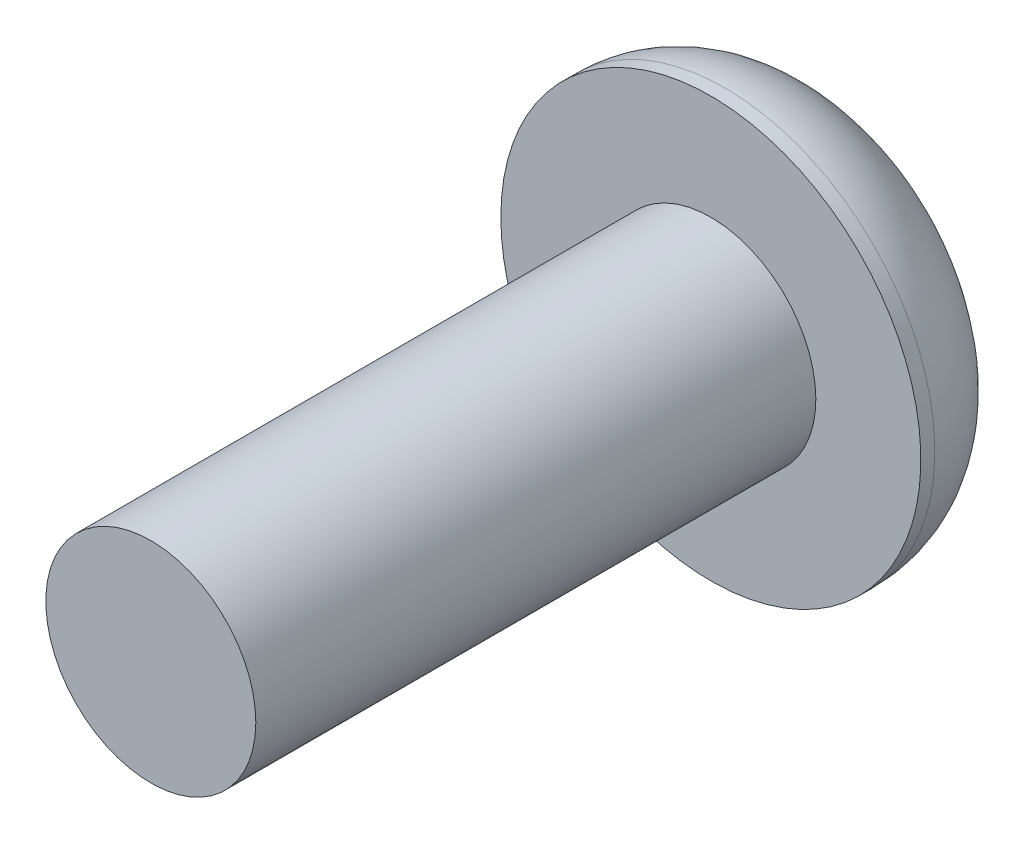
ISO-10303-21;
HEADER;
FILE_DESCRIPTION(('STEP AP214'),'2;1');
FILE_NAME('part.step','',(''),(''),'','','');
FILE_SCHEMA(('AUTOMOTIVE_DESIGN { 1 0 10303 214 1 1 1 1 }'));
ENDSEC;
DATA;
#1=APPLICATION_CONTEXT('core data for automotive mechanical design processes');
#2=APPLICATION_PROTOCOL_DEFINITION('international standard','automotive_design',2000,#1);
#3=PRODUCT_CONTEXT('',#1,'mechanical');
#4=PRODUCT('Part','Part','',(#3));
#5=PRODUCT_RELATED_PRODUCT_CATEGORY('part','',(#4));
#6=PRODUCT_DEFINITION_FORMATION('','',#4);
#7=PRODUCT_DEFINITION_CONTEXT('part definition',#1,'design');
#8=PRODUCT_DEFINITION('design','',#6,#7);
#9=PRODUCT_DEFINITION_SHAPE('','',#8);
#10=(LENGTH_UNIT() NAMED_UNIT(*) SI_UNIT(.MILLI.,.METRE.));
#11=(NAMED_UNIT(*) PLANE_ANGLE_UNIT() SI_UNIT($,.RADIAN.));
#12=(NAMED_UNIT(*) SI_UNIT($,.STERADIAN.) SOLID_ANGLE_UNIT());
#13=UNCERTAINTY_MEASURE_WITH_UNIT(LENGTH_MEASURE(1.E-05),#10,'distance_accuracy_value','');
#14=(GEOMETRIC_REPRESENTATION_CONTEXT(3) GLOBAL_UNCERTAINTY_ASSIGNED_CONTEXT((#13)) GLOBAL_UNIT_ASSIGNED_CONTEXT((#10,
#11,#12)) REPRESENTATION_CONTEXT('',''));
#15=CARTESIAN_POINT('',(0.,0.,0.));
#16=DIRECTION('',(0.,0.,1.));
#17=DIRECTION('',(1.,0.,0.));
#18=AXIS2_PLACEMENT_3D('',#15,#16,#17);
#19=CARTESIAN_POINT('',(0.,0.,8.));
#20=DIRECTION('',(0.,0.,-1.));
#21=DIRECTION('',(-1.,0.,0.));
#22=AXIS2_PLACEMENT_3D('',#19,#20,#21);
#23=CYLINDRICAL_SURFACE('',#22,1.5);
#24=CARTESIAN_POINT('',(0.,0.,8.));
#25=DIRECTION('',(0.,0.,1.));
#26=DIRECTION('',(1.,0.,0.));
#27=AXIS2_PLACEMENT_3D('',#24,#25,#26);
#28=CIRCLE('',#27,1.5);
#29=CARTESIAN_POINT('',(1.5,0.,8.));
#30=VERTEX_POINT('',#29);
#31=EDGE_CURVE('E47',#30,#30,#28,.T.);
#32=ORIENTED_EDGE('',*,*,#31,.F.);
#33=EDGE_LOOP('',(#32));
#34=FACE_BOUND('',#33,.T.);
#35=CARTESIAN_POINT('',(0.,0.,0.));
#36=DIRECTION('',(0.,0.,1.));
#37=DIRECTION('',(1.,0.,0.));
#38=AXIS2_PLACEMENT_3D('',#35,#36,#37);
#39=CIRCLE('',#38,1.5);
#40=CARTESIAN_POINT('',(1.5,0.,0.));
#41=VERTEX_POINT('',#40);
#42=EDGE_CURVE('E51',#41,#41,#39,.T.);
#43=ORIENTED_EDGE('',*,*,#42,.T.);
#44=EDGE_LOOP('',(#43));
#45=FACE_BOUND('',#44,.T.);
#46=ADVANCED_FACE('F36',(#34,#45),#23,.T.);
#47=CARTESIAN_POINT('',(0.,0.,8.));
#48=DIRECTION('',(0.,0.,1.));
#49=DIRECTION('',(1.,0.,0.));
#50=AXIS2_PLACEMENT_3D('',#47,#48,#49);
#51=PLANE('',#50);
#52=ORIENTED_EDGE('',*,*,#31,.T.);
#53=EDGE_LOOP('',(#52));
#54=FACE_BOUND('',#53,.T.);
#55=ADVANCED_FACE('F76',(#54),#51,.T.);
#56=CARTESIAN_POINT('',(0.,0.,-1.7));
#57=DIRECTION('',(0.,0.,1.));
#58=DIRECTION('',(1.,0.,0.));
#59=AXIS2_PLACEMENT_3D('',#56,#57,#58);
#60=CYLINDRICAL_SURFACE('',#59,3.);
#61=CARTESIAN_POINT('',(0.,0.,-0.2));
#62=DIRECTION('',(0.,0.,-1.));
#63=DIRECTION('',(-1.,0.,0.));
#64=AXIS2_PLACEMENT_3D('',#61,#62,#63);
#65=CIRCLE('',#64,3.);
#66=CARTESIAN_POINT('',(-3.,0.,-0.2));
#67=VERTEX_POINT('',#66);
#68=EDGE_CURVE('E10',#67,#67,#65,.F.);
#69=ORIENTED_EDGE('',*,*,#68,.T.);
#70=EDGE_LOOP('',(#69));
#71=FACE_BOUND('',#70,.T.);
#72=CARTESIAN_POINT('',(0.,0.,0.));
#73=DIRECTION('',(0.,0.,-1.));
#74=DIRECTION('',(-1.,0.,0.));
#75=AXIS2_PLACEMENT_3D('',#72,#73,#74);
#76=CIRCLE('',#75,3.);
#77=CARTESIAN_POINT('',(-3.,0.,0.));
#78=VERTEX_POINT('',#77);
#79=EDGE_CURVE('E55',#78,#78,#76,.T.);
#80=ORIENTED_EDGE('',*,*,#79,.T.);
#81=EDGE_LOOP('',(#80));
#82=FACE_BOUND('',#81,.T.);
#83=ADVANCED_FACE('F60',(#71,#82),#60,.T.);
#84=CARTESIAN_POINT('',(0.,0.,-1.7));
#85=DIRECTION('',(0.,0.,-1.));
#86=DIRECTION('',(-1.,0.,0.));
#87=AXIS2_PLACEMENT_3D('',#84,#85,#86);
#88=PLANE('',#87);
#89=CARTESIAN_POINT('',(0.,0.,-1.7));
#90=DIRECTION('',(0.,0.,-1.));
#91=DIRECTION('',(-1.,0.,0.));
#92=AXIS2_PLACEMENT_3D('',#89,#90,#91);
#93=CIRCLE('',#92,1.5);
#94=CARTESIAN_POINT('',(-1.5,0.,-1.7));
#95=VERTEX_POINT('',#94);
#96=EDGE_CURVE('E43',#95,#95,#93,.T.);
#97=ORIENTED_EDGE('',*,*,#96,.T.);
#98=EDGE_LOOP('',(#97));
#99=FACE_BOUND('',#98,.T.);
#100=ADVANCED_FACE('F64',(#99),#88,.T.);
#101=CARTESIAN_POINT('',(0.,0.,0.));
#102=DIRECTION('',(0.,0.,-1.));
#103=DIRECTION('',(-1.,0.,0.));
#104=AXIS2_PLACEMENT_3D('',#101,#102,#103);
#105=PLANE('',#104);
#106=ORIENTED_EDGE('',*,*,#42,.F.);
#107=EDGE_LOOP('',(#106));
#108=FACE_BOUND('',#107,.T.);
#109=ORIENTED_EDGE('',*,*,#79,.F.);
#110=EDGE_LOOP('',(#109));
#111=FACE_BOUND('',#110,.T.);
#112=ADVANCED_FACE('F62',(#108,#111),#105,.F.);
#113=CARTESIAN_POINT('',(0.,0.,-0.2));
#114=DIRECTION('',(0.,0.,-1.));
#115=DIRECTION('',(-1.,0.,0.));
#116=AXIS2_PLACEMENT_3D('',#113,#114,#115);
#117=TOROIDAL_SURFACE('',#116,1.5,1.5);
#118=ORIENTED_EDGE('',*,*,#68,.F.);
#119=EDGE_LOOP('',(#118));
#120=FACE_BOUND('',#119,.T.);
#121=ORIENTED_EDGE('',*,*,#96,.F.);
#122=EDGE_LOOP('',(#121));
#123=FACE_BOUND('',#122,.T.);
#124=ADVANCED_FACE('F38',(#120,#123),#117,.T.);
#125=CLOSED_SHELL('',(#46,#55,#83,#100,#112,#124));
#126=MANIFOLD_SOLID_BREP('B2',#125);
#127=ADVANCED_BREP_SHAPE_REPRESENTATION('',(#18,#126),#14);
#128=SHAPE_DEFINITION_REPRESENTATION(#9,#127);
ENDSEC;
END-ISO-10303-21;
